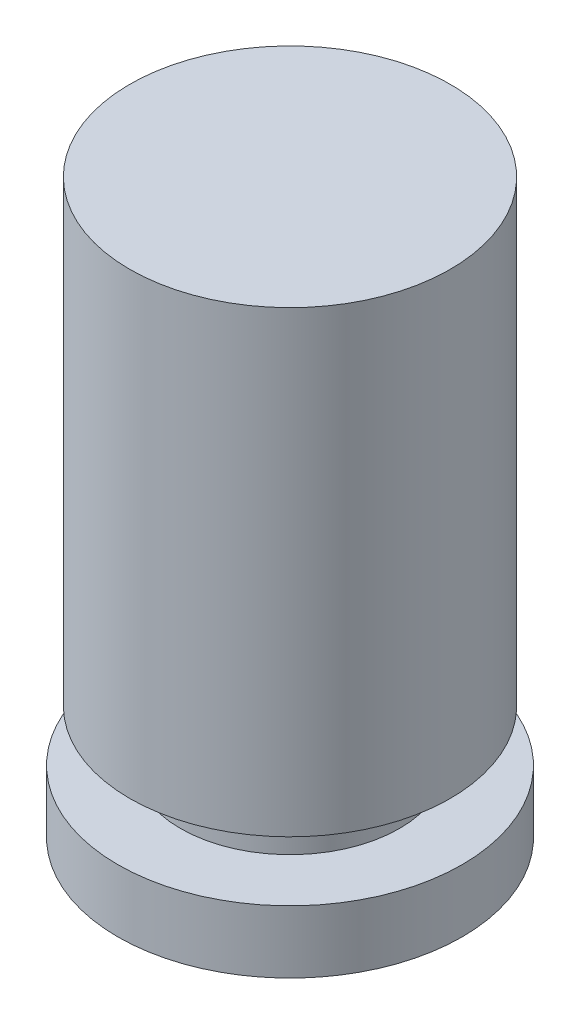
ISO-10303-21;
HEADER;
FILE_DESCRIPTION(('STEP AP214'),'2;1');
FILE_NAME('part.step','',(''),(''),'','','');
FILE_SCHEMA(('AUTOMOTIVE_DESIGN { 1 0 10303 214 1 1 1 1 }'));
ENDSEC;
DATA;
#1=APPLICATION_CONTEXT('core data for automotive mechanical design processes');
#2=APPLICATION_PROTOCOL_DEFINITION('international standard','automotive_design',2000,#1);
#3=PRODUCT_CONTEXT('',#1,'mechanical');
#4=PRODUCT('Part','Part','',(#3));
#5=PRODUCT_RELATED_PRODUCT_CATEGORY('part','',(#4));
#6=PRODUCT_DEFINITION_FORMATION('','',#4);
#7=PRODUCT_DEFINITION_CONTEXT('part definition',#1,'design');
#8=PRODUCT_DEFINITION('design','',#6,#7);
#9=PRODUCT_DEFINITION_SHAPE('','',#8);
#10=(LENGTH_UNIT() NAMED_UNIT(*) SI_UNIT(.MILLI.,.METRE.));
#11=(NAMED_UNIT(*) PLANE_ANGLE_UNIT() SI_UNIT($,.RADIAN.));
#12=(NAMED_UNIT(*) SI_UNIT($,.STERADIAN.) SOLID_ANGLE_UNIT());
#13=UNCERTAINTY_MEASURE_WITH_UNIT(LENGTH_MEASURE(1.E-05),#10,'distance_accuracy_value','');
#14=(GEOMETRIC_REPRESENTATION_CONTEXT(3) GLOBAL_UNCERTAINTY_ASSIGNED_CONTEXT((#13)) GLOBAL_UNIT_ASSIGNED_CONTEXT((#10,
#11,#12)) REPRESENTATION_CONTEXT('',''));
#15=CARTESIAN_POINT('',(0.,0.,0.));
#16=DIRECTION('',(0.,0.,1.));
#17=DIRECTION('',(1.,0.,0.));
#18=AXIS2_PLACEMENT_3D('',#15,#16,#17);
#19=CARTESIAN_POINT('',(0.,12.7,0.));
#20=DIRECTION('',(0.,-1.,0.));
#21=DIRECTION('',(0.,0.,-1.));
#22=AXIS2_PLACEMENT_3D('',#19,#20,#21);
#23=CYLINDRICAL_SURFACE('',#22,34.925);
#24=CARTESIAN_POINT('',(0.,12.7,0.));
#25=DIRECTION('',(0.,1.,0.));
#26=DIRECTION('',(0.,0.,1.));
#27=AXIS2_PLACEMENT_3D('',#24,#25,#26);
#28=CIRCLE('',#27,34.925);
#29=CARTESIAN_POINT('',(0.,12.7,34.925));
#30=VERTEX_POINT('',#29);
#31=EDGE_CURVE('E51',#30,#30,#28,.T.);
#32=ORIENTED_EDGE('',*,*,#31,.F.);
#33=EDGE_LOOP('',(#32));
#34=FACE_BOUND('',#33,.T.);
#35=CARTESIAN_POINT('',(0.,0.,0.));
#36=DIRECTION('',(0.,1.,0.));
#37=DIRECTION('',(0.,0.,1.));
#38=AXIS2_PLACEMENT_3D('',#35,#36,#37);
#39=CIRCLE('',#38,34.925);
#40=CARTESIAN_POINT('',(0.,0.,34.925));
#41=VERTEX_POINT('',#40);
#42=EDGE_CURVE('E46',#41,#41,#39,.T.);
#43=ORIENTED_EDGE('',*,*,#42,.T.);
#44=EDGE_LOOP('',(#43));
#45=FACE_BOUND('',#44,.T.);
#46=ADVANCED_FACE('F43',(#34,#45),#23,.T.);
#47=CARTESIAN_POINT('',(0.,12.7,0.));
#48=DIRECTION('',(0.,1.,0.));
#49=DIRECTION('',(0.,0.,1.));
#50=AXIS2_PLACEMENT_3D('',#47,#48,#49);
#51=PLANE('',#50);
#52=CARTESIAN_POINT('',(0.,12.7,0.));
#53=DIRECTION('',(0.,1.,0.));
#54=DIRECTION('',(0.,0.,1.));
#55=AXIS2_PLACEMENT_3D('',#52,#53,#54);
#56=CIRCLE('',#55,22.225);
#57=CARTESIAN_POINT('',(0.,12.7,22.225));
#58=VERTEX_POINT('',#57);
#59=EDGE_CURVE('E10',#58,#58,#56,.T.);
#60=ORIENTED_EDGE('',*,*,#59,.F.);
#61=EDGE_LOOP('',(#60));
#62=FACE_BOUND('',#61,.T.);
#63=ORIENTED_EDGE('',*,*,#31,.T.);
#64=EDGE_LOOP('',(#63));
#65=FACE_BOUND('',#64,.T.);
#66=ADVANCED_FACE('F89',(#62,#65),#51,.T.);
#67=CARTESIAN_POINT('',(0.,0.,0.));
#68=DIRECTION('',(0.,1.,0.));
#69=DIRECTION('',(0.,0.,1.));
#70=AXIS2_PLACEMENT_3D('',#67,#68,#69);
#71=PLANE('',#70);
#72=ORIENTED_EDGE('',*,*,#42,.F.);
#73=EDGE_LOOP('',(#72));
#74=FACE_BOUND('',#73,.T.);
#75=ADVANCED_FACE('F95',(#74),#71,.F.);
#76=CARTESIAN_POINT('',(0.,23.114,0.));
#77=DIRECTION('',(0.,-1.,0.));
#78=DIRECTION('',(0.,0.,-1.));
#79=AXIS2_PLACEMENT_3D('',#76,#77,#78);
#80=CYLINDRICAL_SURFACE('',#79,22.225);
#81=CARTESIAN_POINT('',(0.,23.114,0.));
#82=DIRECTION('',(0.,1.,0.));
#83=DIRECTION('',(0.,0.,1.));
#84=AXIS2_PLACEMENT_3D('',#81,#82,#83);
#85=CIRCLE('',#84,22.225);
#86=CARTESIAN_POINT('',(0.,23.114,22.225));
#87=VERTEX_POINT('',#86);
#88=EDGE_CURVE('E58',#87,#87,#85,.T.);
#89=ORIENTED_EDGE('',*,*,#88,.F.);
#90=EDGE_LOOP('',(#89));
#91=FACE_BOUND('',#90,.T.);
#92=ORIENTED_EDGE('',*,*,#59,.T.);
#93=EDGE_LOOP('',(#92));
#94=FACE_BOUND('',#93,.T.);
#95=ADVANCED_FACE('F76',(#91,#94),#80,.T.);
#96=CARTESIAN_POINT('',(0.,116.078,0.));
#97=DIRECTION('',(0.,-1.,0.));
#98=DIRECTION('',(0.,0.,-1.));
#99=AXIS2_PLACEMENT_3D('',#96,#97,#98);
#100=CYLINDRICAL_SURFACE('',#99,32.512);
#101=CARTESIAN_POINT('',(0.,116.078,0.));
#102=DIRECTION('',(0.,1.,0.));
#103=DIRECTION('',(0.,0.,1.));
#104=AXIS2_PLACEMENT_3D('',#101,#102,#103);
#105=CIRCLE('',#104,32.512);
#106=CARTESIAN_POINT('',(0.,116.078,32.512));
#107=VERTEX_POINT('',#106);
#108=EDGE_CURVE('E62',#107,#107,#105,.T.);
#109=ORIENTED_EDGE('',*,*,#108,.F.);
#110=EDGE_LOOP('',(#109));
#111=FACE_BOUND('',#110,.T.);
#112=CARTESIAN_POINT('',(0.,23.114,0.));
#113=DIRECTION('',(0.,1.,0.));
#114=DIRECTION('',(0.,0.,1.));
#115=AXIS2_PLACEMENT_3D('',#112,#113,#114);
#116=CIRCLE('',#115,32.512);
#117=CARTESIAN_POINT('',(0.,23.114,32.512));
#118=VERTEX_POINT('',#117);
#119=EDGE_CURVE('E63',#118,#118,#116,.T.);
#120=ORIENTED_EDGE('',*,*,#119,.T.);
#121=EDGE_LOOP('',(#120));
#122=FACE_BOUND('',#121,.T.);
#123=ADVANCED_FACE('F73',(#111,#122),#100,.T.);
#124=CARTESIAN_POINT('',(0.,116.078,0.));
#125=DIRECTION('',(0.,1.,0.));
#126=DIRECTION('',(0.,0.,1.));
#127=AXIS2_PLACEMENT_3D('',#124,#125,#126);
#128=PLANE('',#127);
#129=ORIENTED_EDGE('',*,*,#108,.T.);
#130=EDGE_LOOP('',(#129));
#131=FACE_BOUND('',#130,.T.);
#132=ADVANCED_FACE('F71',(#131),#128,.T.);
#133=CARTESIAN_POINT('',(0.,23.114,0.));
#134=DIRECTION('',(0.,1.,0.));
#135=DIRECTION('',(0.,0.,1.));
#136=AXIS2_PLACEMENT_3D('',#133,#134,#135);
#137=PLANE('',#136);
#138=ORIENTED_EDGE('',*,*,#88,.T.);
#139=EDGE_LOOP('',(#138));
#140=FACE_BOUND('',#139,.T.);
#141=ORIENTED_EDGE('',*,*,#119,.F.);
#142=EDGE_LOOP('',(#141));
#143=FACE_BOUND('',#142,.T.);
#144=ADVANCED_FACE('F80',(#140,#143),#137,.F.);
#145=CLOSED_SHELL('',(#46,#66,#75,#95,#123,#132,#144));
#146=MANIFOLD_SOLID_BREP('B2',#145);
#147=ADVANCED_BREP_SHAPE_REPRESENTATION('',(#18,#146),#14);
#148=SHAPE_DEFINITION_REPRESENTATION(#9,#147);
ENDSEC;
END-ISO-10303-21;
